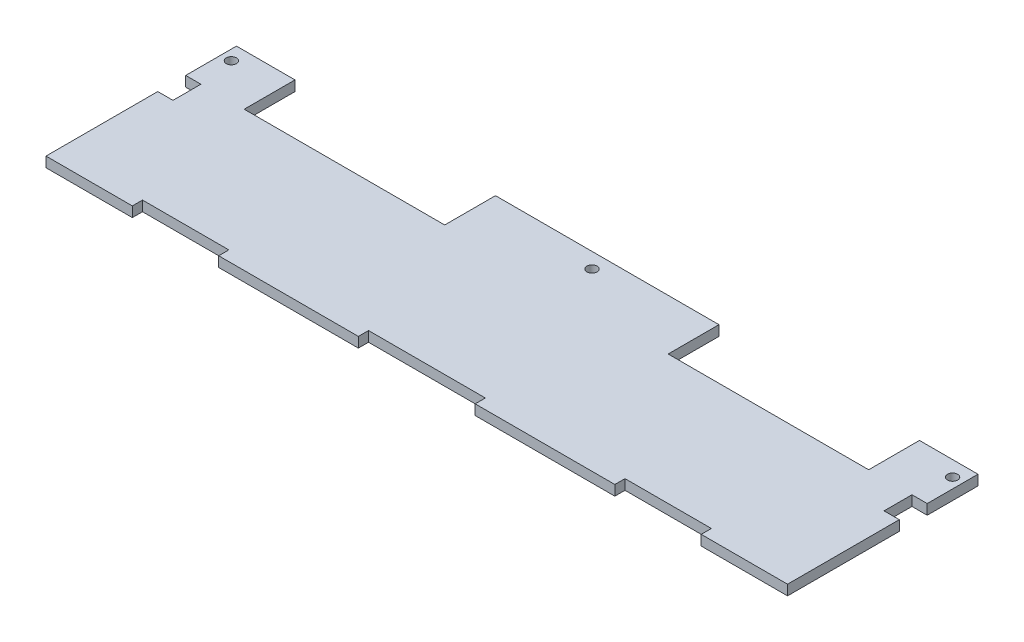
ISO-10303-21;
HEADER;
FILE_DESCRIPTION(('STEP AP214'),'2;1');
FILE_NAME('part.step','',(''),(''),'','','');
FILE_SCHEMA(('AUTOMOTIVE_DESIGN { 1 0 10303 214 1 1 1 1 }'));
ENDSEC;
DATA;
#1=APPLICATION_CONTEXT('core data for automotive mechanical design processes');
#2=APPLICATION_PROTOCOL_DEFINITION('international standard','automotive_design',2000,#1);
#3=PRODUCT_CONTEXT('',#1,'mechanical');
#4=PRODUCT('Part','Part','',(#3));
#5=PRODUCT_RELATED_PRODUCT_CATEGORY('part','',(#4));
#6=PRODUCT_DEFINITION_FORMATION('','',#4);
#7=PRODUCT_DEFINITION_CONTEXT('part definition',#1,'design');
#8=PRODUCT_DEFINITION('design','',#6,#7);
#9=PRODUCT_DEFINITION_SHAPE('','',#8);
#10=(LENGTH_UNIT() NAMED_UNIT(*) SI_UNIT(.MILLI.,.METRE.));
#11=(NAMED_UNIT(*) PLANE_ANGLE_UNIT() SI_UNIT($,.RADIAN.));
#12=(NAMED_UNIT(*) SI_UNIT($,.STERADIAN.) SOLID_ANGLE_UNIT());
#13=UNCERTAINTY_MEASURE_WITH_UNIT(LENGTH_MEASURE(1.E-05),#10,'distance_accuracy_value','');
#14=(GEOMETRIC_REPRESENTATION_CONTEXT(3) GLOBAL_UNCERTAINTY_ASSIGNED_CONTEXT((#13)) GLOBAL_UNIT_ASSIGNED_CONTEXT((#10,
#11,#12)) REPRESENTATION_CONTEXT('',''));
#15=CARTESIAN_POINT('',(0.,0.,0.));
#16=DIRECTION('',(0.,0.,1.));
#17=DIRECTION('',(1.,0.,0.));
#18=AXIS2_PLACEMENT_3D('',#15,#16,#17);
#19=CARTESIAN_POINT('',(146.,4.,37.5));
#20=DIRECTION('',(0.,0.,-1.));
#21=DIRECTION('',(-1.,0.,0.));
#22=AXIS2_PLACEMENT_3D('',#19,#20,#21);
#23=PLANE('',#22);
#24=DIRECTION('',(1.,0.,0.));
#25=VECTOR('',#24,1.);
#26=CARTESIAN_POINT('',(146.,4.,37.5));
#27=LINE('',#26,#25);
#28=CARTESIAN_POINT('',(-77.9999999999998,4.,37.5));
#29=VERTEX_POINT('',#28);
#30=CARTESIAN_POINT('',(-22.9999999999998,4.,37.5));
#31=VERTEX_POINT('',#30);
#32=EDGE_CURVE('E370',#29,#31,#27,.T.);
#33=ORIENTED_EDGE('',*,*,#32,.F.);
#34=DIRECTION('',(0.,1.,0.));
#35=VECTOR('',#34,1.);
#36=CARTESIAN_POINT('',(-77.9999999999998,0.,37.5));
#37=LINE('',#36,#35);
#38=CARTESIAN_POINT('',(-77.9999999999998,0.,37.5));
#39=VERTEX_POINT('',#38);
#40=EDGE_CURVE('E282',#39,#29,#37,.T.);
#41=ORIENTED_EDGE('',*,*,#40,.F.);
#42=DIRECTION('',(1.,0.,0.));
#43=VECTOR('',#42,1.);
#44=CARTESIAN_POINT('',(146.,0.,37.5));
#45=LINE('',#44,#43);
#46=CARTESIAN_POINT('',(-22.9999999999998,0.,37.5));
#47=VERTEX_POINT('',#46);
#48=EDGE_CURVE('E274',#39,#47,#45,.T.);
#49=ORIENTED_EDGE('',*,*,#48,.T.);
#50=DIRECTION('',(0.,1.,0.));
#51=VECTOR('',#50,1.);
#52=CARTESIAN_POINT('',(-22.9999999999998,0.,37.5));
#53=LINE('',#52,#51);
#54=EDGE_CURVE('E302',#47,#31,#53,.T.);
#55=ORIENTED_EDGE('',*,*,#54,.T.);
#56=EDGE_LOOP('',(#33,#41,#49,#55));
#57=FACE_BOUND('',#56,.T.);
#58=ADVANCED_FACE('F40',(#57),#23,.F.);
#59=CARTESIAN_POINT('',(0.,4.,0.));
#60=DIRECTION('',(0.,1.,0.));
#61=DIRECTION('',(0.,0.,1.));
#62=AXIS2_PLACEMENT_3D('',#59,#60,#61);
#63=PLANE('',#62);
#64=DIRECTION('',(0.,0.,-1.));
#65=VECTOR('',#64,1.);
#66=CARTESIAN_POINT('',(-77.9999999999998,4.,0.));
#67=LINE('',#66,#65);
#68=CARTESIAN_POINT('',(-77.9999999999998,4.,33.5));
#69=VERTEX_POINT('',#68);
#70=EDGE_CURVE('E256',#29,#69,#67,.T.);
#71=ORIENTED_EDGE('',*,*,#70,.F.);
#72=ORIENTED_EDGE('',*,*,#32,.T.);
#73=DIRECTION('',(0.,0.,-1.));
#74=VECTOR('',#73,1.);
#75=CARTESIAN_POINT('',(-22.9999999999998,4.,0.));
#76=LINE('',#75,#74);
#77=CARTESIAN_POINT('',(-22.9999999999998,4.,33.5));
#78=VERTEX_POINT('',#77);
#79=EDGE_CURVE('E290',#31,#78,#76,.T.);
#80=ORIENTED_EDGE('',*,*,#79,.T.);
#81=DIRECTION('',(1.,0.,0.));
#82=VECTOR('',#81,1.);
#83=CARTESIAN_POINT('',(0.,4.,33.5));
#84=LINE('',#83,#82);
#85=CARTESIAN_POINT('',(23.,4.,33.5));
#86=VERTEX_POINT('',#85);
#87=EDGE_CURVE('E297',#78,#86,#84,.T.);
#88=ORIENTED_EDGE('',*,*,#87,.T.);
#89=DIRECTION('',(0.,0.,-1.));
#90=VECTOR('',#89,1.);
#91=CARTESIAN_POINT('',(23.,4.,0.));
#92=LINE('',#91,#90);
#93=CARTESIAN_POINT('',(23.,4.,37.5));
#94=VERTEX_POINT('',#93);
#95=EDGE_CURVE('E284',#94,#86,#92,.T.);
#96=ORIENTED_EDGE('',*,*,#95,.F.);
#97=CARTESIAN_POINT('',(78.,4.,37.5));
#98=VERTEX_POINT('',#97);
#99=EDGE_CURVE('E615',#94,#98,#27,.T.);
#100=ORIENTED_EDGE('',*,*,#99,.T.);
#101=DIRECTION('',(0.,0.,-1.));
#102=VECTOR('',#101,1.);
#103=CARTESIAN_POINT('',(78.,4.,0.));
#104=LINE('',#103,#102);
#105=CARTESIAN_POINT('',(78.,4.,33.5));
#106=VERTEX_POINT('',#105);
#107=EDGE_CURVE('E314',#98,#106,#104,.T.);
#108=ORIENTED_EDGE('',*,*,#107,.T.);
#109=DIRECTION('',(1.,0.,0.));
#110=VECTOR('',#109,1.);
#111=CARTESIAN_POINT('',(0.,4.,33.5));
#112=LINE('',#111,#110);
#113=CARTESIAN_POINT('',(112.,4.,33.5));
#114=VERTEX_POINT('',#113);
#115=EDGE_CURVE('E321',#106,#114,#112,.T.);
#116=ORIENTED_EDGE('',*,*,#115,.T.);
#117=DIRECTION('',(0.,0.,1.));
#118=VECTOR('',#117,1.);
#119=CARTESIAN_POINT('',(112.,4.,0.));
#120=LINE('',#119,#118);
#121=CARTESIAN_POINT('',(112.,4.,37.5));
#122=VERTEX_POINT('',#121);
#123=EDGE_CURVE('E305',#114,#122,#120,.T.);
#124=ORIENTED_EDGE('',*,*,#123,.T.);
#125=CARTESIAN_POINT('',(146.,4.,37.5));
#126=VERTEX_POINT('',#125);
#127=EDGE_CURVE('E365',#122,#126,#27,.T.);
#128=ORIENTED_EDGE('',*,*,#127,.T.);
#129=DIRECTION('',(0.,0.,-1.));
#130=VECTOR('',#129,1.);
#131=CARTESIAN_POINT('',(146.,4.,37.5));
#132=LINE('',#131,#130);
#133=CARTESIAN_POINT('',(146.,4.,-6.49999999999996));
#134=VERTEX_POINT('',#133);
#135=EDGE_CURVE('E369',#126,#134,#132,.T.);
#136=ORIENTED_EDGE('',*,*,#135,.T.);
#137=DIRECTION('',(-1.,0.,0.));
#138=VECTOR('',#137,1.);
#139=CARTESIAN_POINT('',(146.,4.,-6.49999999999996));
#140=LINE('',#139,#138);
#141=CARTESIAN_POINT('',(140.,4.,-6.49999999999996));
#142=VERTEX_POINT('',#141);
#143=EDGE_CURVE('E372',#134,#142,#140,.T.);
#144=ORIENTED_EDGE('',*,*,#143,.T.);
#145=DIRECTION('',(0.,0.,-1.));
#146=VECTOR('',#145,1.);
#147=CARTESIAN_POINT('',(140.,4.,-17.5));
#148=LINE('',#147,#146);
#149=CARTESIAN_POINT('',(140.,4.,-17.5));
#150=VERTEX_POINT('',#149);
#151=EDGE_CURVE('E374',#142,#150,#148,.T.);
#152=ORIENTED_EDGE('',*,*,#151,.T.);
#153=DIRECTION('',(1.,0.,0.));
#154=VECTOR('',#153,1.);
#155=CARTESIAN_POINT('',(146.,4.,-17.5));
#156=LINE('',#155,#154);
#157=CARTESIAN_POINT('',(146.,4.,-17.5));
#158=VERTEX_POINT('',#157);
#159=EDGE_CURVE('E376',#150,#158,#156,.T.);
#160=ORIENTED_EDGE('',*,*,#159,.T.);
#161=DIRECTION('',(0.,0.,-1.));
#162=VECTOR('',#161,1.);
#163=CARTESIAN_POINT('',(146.,4.,-17.5));
#164=LINE('',#163,#162);
#165=CARTESIAN_POINT('',(146.,4.,-37.5));
#166=VERTEX_POINT('',#165);
#167=EDGE_CURVE('E378',#158,#166,#164,.T.);
#168=ORIENTED_EDGE('',*,*,#167,.T.);
#169=DIRECTION('',(-1.,0.,0.));
#170=VECTOR('',#169,1.);
#171=CARTESIAN_POINT('',(146.,4.,-37.5));
#172=LINE('',#171,#170);
#173=CARTESIAN_POINT('',(122.95,4.,-37.5));
#174=VERTEX_POINT('',#173);
#175=EDGE_CURVE('E380',#166,#174,#172,.T.);
#176=ORIENTED_EDGE('',*,*,#175,.T.);
#177=DIRECTION('',(0.,0.,1.));
#178=VECTOR('',#177,1.);
#179=CARTESIAN_POINT('',(122.95,4.,-37.5));
#180=LINE('',#179,#178);
#181=CARTESIAN_POINT('',(122.95,4.,-17.5));
#182=VERTEX_POINT('',#181);
#183=EDGE_CURVE('E382',#174,#182,#180,.T.);
#184=ORIENTED_EDGE('',*,*,#183,.T.);
#185=DIRECTION('',(-1.,0.,0.));
#186=VECTOR('',#185,1.);
#187=CARTESIAN_POINT('',(44.,4.,-17.5));
#188=LINE('',#187,#186);
#189=CARTESIAN_POINT('',(44.,4.,-17.5));
#190=VERTEX_POINT('',#189);
#191=EDGE_CURVE('E384',#182,#190,#188,.T.);
#192=ORIENTED_EDGE('',*,*,#191,.T.);
#193=DIRECTION('',(0.,0.,-1.));
#194=VECTOR('',#193,1.);
#195=CARTESIAN_POINT('',(44.,4.,-37.5));
#196=LINE('',#195,#194);
#197=CARTESIAN_POINT('',(44.,4.,-37.5));
#198=VERTEX_POINT('',#197);
#199=EDGE_CURVE('E386',#190,#198,#196,.T.);
#200=ORIENTED_EDGE('',*,*,#199,.T.);
#201=DIRECTION('',(-1.,0.,0.));
#202=VECTOR('',#201,1.);
#203=CARTESIAN_POINT('',(44.,4.,-37.5));
#204=LINE('',#203,#202);
#205=CARTESIAN_POINT('',(-44.,4.,-37.5));
#206=VERTEX_POINT('',#205);
#207=EDGE_CURVE('E388',#198,#206,#204,.T.);
#208=ORIENTED_EDGE('',*,*,#207,.T.);
#209=DIRECTION('',(0.,0.,1.));
#210=VECTOR('',#209,1.);
#211=CARTESIAN_POINT('',(-44.,4.,-17.5));
#212=LINE('',#211,#210);
#213=CARTESIAN_POINT('',(-44.,4.,-17.5));
#214=VERTEX_POINT('',#213);
#215=EDGE_CURVE('E390',#206,#214,#212,.T.);
#216=ORIENTED_EDGE('',*,*,#215,.T.);
#217=DIRECTION('',(-1.,0.,0.));
#218=VECTOR('',#217,1.);
#219=CARTESIAN_POINT('',(-122.95,4.,-17.5));
#220=LINE('',#219,#218);
#221=CARTESIAN_POINT('',(-122.95,4.,-17.5));
#222=VERTEX_POINT('',#221);
#223=EDGE_CURVE('E392',#214,#222,#220,.T.);
#224=ORIENTED_EDGE('',*,*,#223,.T.);
#225=DIRECTION('',(0.,0.,-1.));
#226=VECTOR('',#225,1.);
#227=CARTESIAN_POINT('',(-122.95,4.,-37.5));
#228=LINE('',#227,#226);
#229=CARTESIAN_POINT('',(-122.95,4.,-37.5));
#230=VERTEX_POINT('',#229);
#231=EDGE_CURVE('E394',#222,#230,#228,.T.);
#232=ORIENTED_EDGE('',*,*,#231,.T.);
#233=DIRECTION('',(-1.,0.,0.));
#234=VECTOR('',#233,1.);
#235=CARTESIAN_POINT('',(-122.95,4.,-37.5));
#236=LINE('',#235,#234);
#237=CARTESIAN_POINT('',(-146.,4.,-37.5));
#238=VERTEX_POINT('',#237);
#239=EDGE_CURVE('E396',#230,#238,#236,.T.);
#240=ORIENTED_EDGE('',*,*,#239,.T.);
#241=DIRECTION('',(0.,0.,1.));
#242=VECTOR('',#241,1.);
#243=CARTESIAN_POINT('',(-146.,4.,-17.4999999999997));
#244=LINE('',#243,#242);
#245=CARTESIAN_POINT('',(-146.,4.,-17.4999999999997));
#246=VERTEX_POINT('',#245);
#247=EDGE_CURVE('E353',#238,#246,#244,.T.);
#248=ORIENTED_EDGE('',*,*,#247,.T.);
#249=DIRECTION('',(1.,0.,0.));
#250=VECTOR('',#249,1.);
#251=CARTESIAN_POINT('',(-146.,4.,-17.4999999999997));
#252=LINE('',#251,#250);
#253=CARTESIAN_POINT('',(-140.,4.,-17.4999999999997));
#254=VERTEX_POINT('',#253);
#255=EDGE_CURVE('E356',#246,#254,#252,.T.);
#256=ORIENTED_EDGE('',*,*,#255,.T.);
#257=DIRECTION('',(0.,0.,1.));
#258=VECTOR('',#257,1.);
#259=CARTESIAN_POINT('',(-140.,4.,-17.4999999999997));
#260=LINE('',#259,#258);
#261=CARTESIAN_POINT('',(-140.,4.,-6.49999999999975));
#262=VERTEX_POINT('',#261);
#263=EDGE_CURVE('E359',#254,#262,#260,.T.);
#264=ORIENTED_EDGE('',*,*,#263,.T.);
#265=DIRECTION('',(-1.,0.,0.));
#266=VECTOR('',#265,1.);
#267=CARTESIAN_POINT('',(-146.,4.,-6.49999999999974));
#268=LINE('',#267,#266);
#269=CARTESIAN_POINT('',(-146.,4.,-6.49999999999974));
#270=VERTEX_POINT('',#269);
#271=EDGE_CURVE('E361',#262,#270,#268,.T.);
#272=ORIENTED_EDGE('',*,*,#271,.T.);
#273=DIRECTION('',(0.,0.,1.));
#274=VECTOR('',#273,1.);
#275=CARTESIAN_POINT('',(-146.,4.,37.5));
#276=LINE('',#275,#274);
#277=CARTESIAN_POINT('',(-146.,4.,37.5));
#278=VERTEX_POINT('',#277);
#279=EDGE_CURVE('E363',#270,#278,#276,.T.);
#280=ORIENTED_EDGE('',*,*,#279,.T.);
#281=CARTESIAN_POINT('',(-112.,4.,37.5));
#282=VERTEX_POINT('',#281);
#283=EDGE_CURVE('E366',#278,#282,#27,.T.);
#284=ORIENTED_EDGE('',*,*,#283,.T.);
#285=DIRECTION('',(0.,0.,1.));
#286=VECTOR('',#285,1.);
#287=CARTESIAN_POINT('',(-112.,4.,0.));
#288=LINE('',#287,#286);
#289=CARTESIAN_POINT('',(-112.,4.,33.5));
#290=VERTEX_POINT('',#289);
#291=EDGE_CURVE('E55',#290,#282,#288,.T.);
#292=ORIENTED_EDGE('',*,*,#291,.F.);
#293=DIRECTION('',(-1.,0.,0.));
#294=VECTOR('',#293,1.);
#295=CARTESIAN_POINT('',(0.,4.,33.5));
#296=LINE('',#295,#294);
#297=EDGE_CURVE('E276',#69,#290,#296,.T.);
#298=ORIENTED_EDGE('',*,*,#297,.F.);
#299=EDGE_LOOP('',(#71,#72,#80,#88,#96,#100,#108,#116,#124,#128,#136,#144,#152,#160,#168,#176,
#184,#192,#200,#208,#216,#224,#232,#240,#248,#256,#264,#272,#280,#284,#292,#298));
#300=FACE_BOUND('',#299,.T.);
#301=CARTESIAN_POINT('',(142.,4.,-31.5));
#302=DIRECTION('',(0.,1.,0.));
#303=DIRECTION('',(0.,0.,1.));
#304=AXIS2_PLACEMENT_3D('',#301,#302,#303);
#305=CIRCLE('',#304,2.);
#306=CARTESIAN_POINT('',(142.,4.,-29.5));
#307=VERTEX_POINT('',#306);
#308=EDGE_CURVE('E341',#307,#307,#305,.T.);
#309=ORIENTED_EDGE('',*,*,#308,.F.);
#310=EDGE_LOOP('',(#309));
#311=FACE_BOUND('',#310,.T.);
#312=CARTESIAN_POINT('',(-142.,4.,-31.5));
#313=DIRECTION('',(0.,1.,0.));
#314=DIRECTION('',(0.,0.,1.));
#315=AXIS2_PLACEMENT_3D('',#312,#313,#314);
#316=CIRCLE('',#315,2.);
#317=CARTESIAN_POINT('',(-142.,4.,-29.5));
#318=VERTEX_POINT('',#317);
#319=EDGE_CURVE('E347',#318,#318,#316,.T.);
#320=ORIENTED_EDGE('',*,*,#319,.F.);
#321=EDGE_LOOP('',(#320));
#322=FACE_BOUND('',#321,.T.);
#323=CARTESIAN_POINT('',(0.,4.,-31.5));
#324=DIRECTION('',(0.,1.,0.));
#325=DIRECTION('',(0.,0.,1.));
#326=AXIS2_PLACEMENT_3D('',#323,#324,#325);
#327=CIRCLE('',#326,2.);
#328=CARTESIAN_POINT('',(0.,4.,-29.5));
#329=VERTEX_POINT('',#328);
#330=EDGE_CURVE('E335',#329,#329,#327,.T.);
#331=ORIENTED_EDGE('',*,*,#330,.F.);
#332=EDGE_LOOP('',(#331));
#333=FACE_BOUND('',#332,.T.);
#334=ADVANCED_FACE('F514',(#300,#311,#322,#333),#63,.T.);
#335=CARTESIAN_POINT('',(0.,0.,0.));
#336=DIRECTION('',(0.,1.,0.));
#337=DIRECTION('',(0.,0.,1.));
#338=AXIS2_PLACEMENT_3D('',#335,#336,#337);
#339=PLANE('',#338);
#340=ORIENTED_EDGE('',*,*,#48,.F.);
#341=DIRECTION('',(0.,0.,-1.));
#342=VECTOR('',#341,1.);
#343=CARTESIAN_POINT('',(-77.9999999999998,0.,0.));
#344=LINE('',#343,#342);
#345=CARTESIAN_POINT('',(-77.9999999999998,0.,33.5));
#346=VERTEX_POINT('',#345);
#347=EDGE_CURVE('E253',#39,#346,#344,.T.);
#348=ORIENTED_EDGE('',*,*,#347,.T.);
#349=DIRECTION('',(-1.,0.,0.));
#350=VECTOR('',#349,1.);
#351=CARTESIAN_POINT('',(0.,0.,33.5));
#352=LINE('',#351,#350);
#353=CARTESIAN_POINT('',(-112.,0.,33.5));
#354=VERTEX_POINT('',#353);
#355=EDGE_CURVE('E264',#346,#354,#352,.T.);
#356=ORIENTED_EDGE('',*,*,#355,.T.);
#357=DIRECTION('',(0.,0.,1.));
#358=VECTOR('',#357,1.);
#359=CARTESIAN_POINT('',(-112.,0.,0.));
#360=LINE('',#359,#358);
#361=CARTESIAN_POINT('',(-112.,0.,37.5));
#362=VERTEX_POINT('',#361);
#363=EDGE_CURVE('E261',#354,#362,#360,.T.);
#364=ORIENTED_EDGE('',*,*,#363,.T.);
#365=CARTESIAN_POINT('',(-146.,0.,37.5));
#366=VERTEX_POINT('',#365);
#367=EDGE_CURVE('E410',#366,#362,#45,.T.);
#368=ORIENTED_EDGE('',*,*,#367,.F.);
#369=DIRECTION('',(0.,0.,1.));
#370=VECTOR('',#369,1.);
#371=CARTESIAN_POINT('',(-146.,0.,37.5));
#372=LINE('',#371,#370);
#373=CARTESIAN_POINT('',(-146.,0.,-6.49999999999974));
#374=VERTEX_POINT('',#373);
#375=EDGE_CURVE('E407',#374,#366,#372,.T.);
#376=ORIENTED_EDGE('',*,*,#375,.F.);
#377=DIRECTION('',(-1.,0.,0.));
#378=VECTOR('',#377,1.);
#379=CARTESIAN_POINT('',(-146.,0.,-6.49999999999974));
#380=LINE('',#379,#378);
#381=CARTESIAN_POINT('',(-140.,0.,-6.49999999999975));
#382=VERTEX_POINT('',#381);
#383=EDGE_CURVE('E405',#382,#374,#380,.T.);
#384=ORIENTED_EDGE('',*,*,#383,.F.);
#385=DIRECTION('',(0.,0.,1.));
#386=VECTOR('',#385,1.);
#387=CARTESIAN_POINT('',(-140.,0.,-17.4999999999997));
#388=LINE('',#387,#386);
#389=CARTESIAN_POINT('',(-140.,0.,-17.4999999999997));
#390=VERTEX_POINT('',#389);
#391=EDGE_CURVE('E403',#390,#382,#388,.T.);
#392=ORIENTED_EDGE('',*,*,#391,.F.);
#393=DIRECTION('',(1.,0.,0.));
#394=VECTOR('',#393,1.);
#395=CARTESIAN_POINT('',(-146.,0.,-17.4999999999997));
#396=LINE('',#395,#394);
#397=CARTESIAN_POINT('',(-146.,0.,-17.4999999999997));
#398=VERTEX_POINT('',#397);
#399=EDGE_CURVE('E401',#398,#390,#396,.T.);
#400=ORIENTED_EDGE('',*,*,#399,.F.);
#401=DIRECTION('',(0.,0.,1.));
#402=VECTOR('',#401,1.);
#403=CARTESIAN_POINT('',(-146.,0.,-17.4999999999997));
#404=LINE('',#403,#402);
#405=CARTESIAN_POINT('',(-146.,0.,-37.5));
#406=VERTEX_POINT('',#405);
#407=EDGE_CURVE('E350',#406,#398,#404,.T.);
#408=ORIENTED_EDGE('',*,*,#407,.F.);
#409=DIRECTION('',(-1.,0.,0.));
#410=VECTOR('',#409,1.);
#411=CARTESIAN_POINT('',(-122.95,0.,-37.5));
#412=LINE('',#411,#410);
#413=CARTESIAN_POINT('',(-122.95,0.,-37.5));
#414=VERTEX_POINT('',#413);
#415=EDGE_CURVE('E357',#414,#406,#412,.T.);
#416=ORIENTED_EDGE('',*,*,#415,.F.);
#417=DIRECTION('',(0.,0.,-1.));
#418=VECTOR('',#417,1.);
#419=CARTESIAN_POINT('',(-122.95,0.,-37.5));
#420=LINE('',#419,#418);
#421=CARTESIAN_POINT('',(-122.95,0.,-17.5));
#422=VERTEX_POINT('',#421);
#423=EDGE_CURVE('E437',#422,#414,#420,.T.);
#424=ORIENTED_EDGE('',*,*,#423,.F.);
#425=DIRECTION('',(-1.,0.,0.));
#426=VECTOR('',#425,1.);
#427=CARTESIAN_POINT('',(-122.95,0.,-17.5));
#428=LINE('',#427,#426);
#429=CARTESIAN_POINT('',(-44.,0.,-17.5));
#430=VERTEX_POINT('',#429);
#431=EDGE_CURVE('E435',#430,#422,#428,.T.);
#432=ORIENTED_EDGE('',*,*,#431,.F.);
#433=DIRECTION('',(0.,0.,1.));
#434=VECTOR('',#433,1.);
#435=CARTESIAN_POINT('',(-44.,0.,-17.5));
#436=LINE('',#435,#434);
#437=CARTESIAN_POINT('',(-44.,0.,-37.5));
#438=VERTEX_POINT('',#437);
#439=EDGE_CURVE('E433',#438,#430,#436,.T.);
#440=ORIENTED_EDGE('',*,*,#439,.F.);
#441=DIRECTION('',(-1.,0.,0.));
#442=VECTOR('',#441,1.);
#443=CARTESIAN_POINT('',(44.,0.,-37.5));
#444=LINE('',#443,#442);
#445=CARTESIAN_POINT('',(44.,0.,-37.5));
#446=VERTEX_POINT('',#445);
#447=EDGE_CURVE('E431',#446,#438,#444,.T.);
#448=ORIENTED_EDGE('',*,*,#447,.F.);
#449=DIRECTION('',(0.,0.,-1.));
#450=VECTOR('',#449,1.);
#451=CARTESIAN_POINT('',(44.,0.,-37.5));
#452=LINE('',#451,#450);
#453=CARTESIAN_POINT('',(44.,0.,-17.5));
#454=VERTEX_POINT('',#453);
#455=EDGE_CURVE('E429',#454,#446,#452,.T.);
#456=ORIENTED_EDGE('',*,*,#455,.F.);
#457=DIRECTION('',(-1.,0.,0.));
#458=VECTOR('',#457,1.);
#459=CARTESIAN_POINT('',(44.,0.,-17.5));
#460=LINE('',#459,#458);
#461=CARTESIAN_POINT('',(122.95,0.,-17.5));
#462=VERTEX_POINT('',#461);
#463=EDGE_CURVE('E427',#462,#454,#460,.T.);
#464=ORIENTED_EDGE('',*,*,#463,.F.);
#465=DIRECTION('',(0.,0.,1.));
#466=VECTOR('',#465,1.);
#467=CARTESIAN_POINT('',(122.95,0.,-37.5));
#468=LINE('',#467,#466);
#469=CARTESIAN_POINT('',(122.95,0.,-37.5));
#470=VERTEX_POINT('',#469);
#471=EDGE_CURVE('E425',#470,#462,#468,.T.);
#472=ORIENTED_EDGE('',*,*,#471,.F.);
#473=DIRECTION('',(-1.,0.,0.));
#474=VECTOR('',#473,1.);
#475=CARTESIAN_POINT('',(146.,0.,-37.5));
#476=LINE('',#475,#474);
#477=CARTESIAN_POINT('',(146.,0.,-37.5));
#478=VERTEX_POINT('',#477);
#479=EDGE_CURVE('E423',#478,#470,#476,.T.);
#480=ORIENTED_EDGE('',*,*,#479,.F.);
#481=DIRECTION('',(0.,0.,-1.));
#482=VECTOR('',#481,1.);
#483=CARTESIAN_POINT('',(146.,0.,-17.5));
#484=LINE('',#483,#482);
#485=CARTESIAN_POINT('',(146.,0.,-17.5));
#486=VERTEX_POINT('',#485);
#487=EDGE_CURVE('E421',#486,#478,#484,.T.);
#488=ORIENTED_EDGE('',*,*,#487,.F.);
#489=DIRECTION('',(1.,0.,0.));
#490=VECTOR('',#489,1.);
#491=CARTESIAN_POINT('',(146.,0.,-17.5));
#492=LINE('',#491,#490);
#493=CARTESIAN_POINT('',(140.,0.,-17.5));
#494=VERTEX_POINT('',#493);
#495=EDGE_CURVE('E419',#494,#486,#492,.T.);
#496=ORIENTED_EDGE('',*,*,#495,.F.);
#497=DIRECTION('',(0.,0.,-1.));
#498=VECTOR('',#497,1.);
#499=CARTESIAN_POINT('',(140.,0.,-17.5));
#500=LINE('',#499,#498);
#501=CARTESIAN_POINT('',(140.,0.,-6.49999999999996));
#502=VERTEX_POINT('',#501);
#503=EDGE_CURVE('E417',#502,#494,#500,.T.);
#504=ORIENTED_EDGE('',*,*,#503,.F.);
#505=DIRECTION('',(-1.,0.,0.));
#506=VECTOR('',#505,1.);
#507=CARTESIAN_POINT('',(146.,0.,-6.49999999999996));
#508=LINE('',#507,#506);
#509=CARTESIAN_POINT('',(146.,0.,-6.49999999999996));
#510=VERTEX_POINT('',#509);
#511=EDGE_CURVE('E415',#510,#502,#508,.T.);
#512=ORIENTED_EDGE('',*,*,#511,.F.);
#513=DIRECTION('',(0.,0.,-1.));
#514=VECTOR('',#513,1.);
#515=CARTESIAN_POINT('',(146.,0.,37.5));
#516=LINE('',#515,#514);
#517=CARTESIAN_POINT('',(146.,0.,37.5));
#518=VERTEX_POINT('',#517);
#519=EDGE_CURVE('E413',#518,#510,#516,.T.);
#520=ORIENTED_EDGE('',*,*,#519,.F.);
#521=CARTESIAN_POINT('',(112.,0.,37.5));
#522=VERTEX_POINT('',#521);
#523=EDGE_CURVE('E409',#522,#518,#45,.T.);
#524=ORIENTED_EDGE('',*,*,#523,.F.);
#525=DIRECTION('',(0.,0.,1.));
#526=VECTOR('',#525,1.);
#527=CARTESIAN_POINT('',(112.,0.,0.));
#528=LINE('',#527,#526);
#529=CARTESIAN_POINT('',(112.,0.,33.5));
#530=VERTEX_POINT('',#529);
#531=EDGE_CURVE('E311',#530,#522,#528,.T.);
#532=ORIENTED_EDGE('',*,*,#531,.F.);
#533=DIRECTION('',(1.,0.,0.));
#534=VECTOR('',#533,1.);
#535=CARTESIAN_POINT('',(0.,0.,33.5));
#536=LINE('',#535,#534);
#537=CARTESIAN_POINT('',(78.,0.,33.5));
#538=VERTEX_POINT('',#537);
#539=EDGE_CURVE('E313',#538,#530,#536,.T.);
#540=ORIENTED_EDGE('',*,*,#539,.F.);
#541=DIRECTION('',(0.,0.,-1.));
#542=VECTOR('',#541,1.);
#543=CARTESIAN_POINT('',(78.,0.,0.));
#544=LINE('',#543,#542);
#545=CARTESIAN_POINT('',(78.,0.,37.5));
#546=VERTEX_POINT('',#545);
#547=EDGE_CURVE('E316',#546,#538,#544,.T.);
#548=ORIENTED_EDGE('',*,*,#547,.F.);
#549=CARTESIAN_POINT('',(23.,0.,37.5));
#550=VERTEX_POINT('',#549);
#551=EDGE_CURVE('E597',#550,#546,#45,.T.);
#552=ORIENTED_EDGE('',*,*,#551,.F.);
#553=DIRECTION('',(0.,0.,-1.));
#554=VECTOR('',#553,1.);
#555=CARTESIAN_POINT('',(23.,0.,0.));
#556=LINE('',#555,#554);
#557=CARTESIAN_POINT('',(23.,0.,33.5));
#558=VERTEX_POINT('',#557);
#559=EDGE_CURVE('E63',#550,#558,#556,.T.);
#560=ORIENTED_EDGE('',*,*,#559,.T.);
#561=DIRECTION('',(1.,0.,0.));
#562=VECTOR('',#561,1.);
#563=CARTESIAN_POINT('',(0.,0.,33.5));
#564=LINE('',#563,#562);
#565=CARTESIAN_POINT('',(-22.9999999999998,0.,33.5));
#566=VERTEX_POINT('',#565);
#567=EDGE_CURVE('E289',#566,#558,#564,.T.);
#568=ORIENTED_EDGE('',*,*,#567,.F.);
#569=DIRECTION('',(0.,0.,-1.));
#570=VECTOR('',#569,1.);
#571=CARTESIAN_POINT('',(-22.9999999999998,0.,0.));
#572=LINE('',#571,#570);
#573=EDGE_CURVE('E292',#47,#566,#572,.T.);
#574=ORIENTED_EDGE('',*,*,#573,.F.);
#575=EDGE_LOOP('',(#340,#348,#356,#364,#368,#376,#384,#392,#400,#408,#416,#424,#432,#440,#448,
#456,#464,#472,#480,#488,#496,#504,#512,#520,#524,#532,#540,#548,#552,#560,#568,#574));
#576=FACE_BOUND('',#575,.T.);
#577=CARTESIAN_POINT('',(-142.,0.,-31.5));
#578=DIRECTION('',(0.,1.,0.));
#579=DIRECTION('',(0.,0.,1.));
#580=AXIS2_PLACEMENT_3D('',#577,#578,#579);
#581=CIRCLE('',#580,2.);
#582=CARTESIAN_POINT('',(-142.,0.,-29.5));
#583=VERTEX_POINT('',#582);
#584=EDGE_CURVE('E344',#583,#583,#581,.T.);
#585=ORIENTED_EDGE('',*,*,#584,.T.);
#586=EDGE_LOOP('',(#585));
#587=FACE_BOUND('',#586,.T.);
#588=CARTESIAN_POINT('',(142.,0.,-31.5));
#589=DIRECTION('',(0.,1.,0.));
#590=DIRECTION('',(0.,0.,1.));
#591=AXIS2_PLACEMENT_3D('',#588,#589,#590);
#592=CIRCLE('',#591,2.);
#593=CARTESIAN_POINT('',(142.,0.,-29.5));
#594=VERTEX_POINT('',#593);
#595=EDGE_CURVE('E338',#594,#594,#592,.T.);
#596=ORIENTED_EDGE('',*,*,#595,.T.);
#597=EDGE_LOOP('',(#596));
#598=FACE_BOUND('',#597,.T.);
#599=CARTESIAN_POINT('',(0.,0.,-31.5));
#600=DIRECTION('',(0.,1.,0.));
#601=DIRECTION('',(0.,0.,1.));
#602=AXIS2_PLACEMENT_3D('',#599,#600,#601);
#603=CIRCLE('',#602,2.);
#604=CARTESIAN_POINT('',(0.,0.,-29.5));
#605=VERTEX_POINT('',#604);
#606=EDGE_CURVE('E328',#605,#605,#603,.T.);
#607=ORIENTED_EDGE('',*,*,#606,.T.);
#608=EDGE_LOOP('',(#607));
#609=FACE_BOUND('',#608,.T.);
#610=ADVANCED_FACE('F271',(#576,#587,#598,#609),#339,.F.);
#611=ORIENTED_EDGE('',*,*,#367,.T.);
#612=DIRECTION('',(0.,1.,0.));
#613=VECTOR('',#612,1.);
#614=CARTESIAN_POINT('',(-112.,0.,37.5));
#615=LINE('',#614,#613);
#616=EDGE_CURVE('E285',#362,#282,#615,.T.);
#617=ORIENTED_EDGE('',*,*,#616,.T.);
#618=ORIENTED_EDGE('',*,*,#283,.F.);
#619=DIRECTION('',(0.,-1.,0.));
#620=VECTOR('',#619,1.);
#621=CARTESIAN_POINT('',(-146.,4.,37.5));
#622=LINE('',#621,#620);
#623=EDGE_CURVE('E484',#278,#366,#622,.T.);
#624=ORIENTED_EDGE('',*,*,#623,.T.);
#625=EDGE_LOOP('',(#611,#617,#618,#624));
#626=FACE_BOUND('',#625,.T.);
#627=ADVANCED_FACE('F632',(#626),#23,.F.);
#628=DIRECTION('',(0.,1.,0.));
#629=VECTOR('',#628,1.);
#630=CARTESIAN_POINT('',(112.,0.,37.5));
#631=LINE('',#630,#629);
#632=EDGE_CURVE('E326',#522,#122,#631,.T.);
#633=ORIENTED_EDGE('',*,*,#632,.F.);
#634=ORIENTED_EDGE('',*,*,#523,.T.);
#635=DIRECTION('',(0.,-1.,0.));
#636=VECTOR('',#635,1.);
#637=CARTESIAN_POINT('',(146.,4.,37.5));
#638=LINE('',#637,#636);
#639=EDGE_CURVE('E481',#126,#518,#638,.T.);
#640=ORIENTED_EDGE('',*,*,#639,.F.);
#641=ORIENTED_EDGE('',*,*,#127,.F.);
#642=EDGE_LOOP('',(#633,#634,#640,#641));
#643=FACE_BOUND('',#642,.T.);
#644=ADVANCED_FACE('F595',(#643),#23,.F.);
#645=ORIENTED_EDGE('',*,*,#99,.F.);
#646=DIRECTION('',(0.,1.,0.));
#647=VECTOR('',#646,1.);
#648=CARTESIAN_POINT('',(23.,0.,37.5));
#649=LINE('',#648,#647);
#650=EDGE_CURVE('E294',#550,#94,#649,.T.);
#651=ORIENTED_EDGE('',*,*,#650,.F.);
#652=ORIENTED_EDGE('',*,*,#551,.T.);
#653=DIRECTION('',(0.,1.,0.));
#654=VECTOR('',#653,1.);
#655=CARTESIAN_POINT('',(78.,0.,37.5));
#656=LINE('',#655,#654);
#657=EDGE_CURVE('E329',#546,#98,#656,.T.);
#658=ORIENTED_EDGE('',*,*,#657,.T.);
#659=EDGE_LOOP('',(#645,#651,#652,#658));
#660=FACE_BOUND('',#659,.T.);
#661=ADVANCED_FACE('F629',(#660),#23,.F.);
#662=CARTESIAN_POINT('',(-146.,4.,-17.4999999999997));
#663=DIRECTION('',(1.,0.,0.));
#664=DIRECTION('',(0.,0.,-1.));
#665=AXIS2_PLACEMENT_3D('',#662,#663,#664);
#666=PLANE('',#665);
#667=ORIENTED_EDGE('',*,*,#407,.T.);
#668=DIRECTION('',(0.,-1.,0.));
#669=VECTOR('',#668,1.);
#670=CARTESIAN_POINT('',(-146.,4.,-17.4999999999997));
#671=LINE('',#670,#669);
#672=EDGE_CURVE('E11',#246,#398,#671,.T.);
#673=ORIENTED_EDGE('',*,*,#672,.F.);
#674=ORIENTED_EDGE('',*,*,#247,.F.);
#675=DIRECTION('',(0.,-1.,0.));
#676=VECTOR('',#675,1.);
#677=CARTESIAN_POINT('',(-146.,4.,-37.5));
#678=LINE('',#677,#676);
#679=EDGE_CURVE('E398',#238,#406,#678,.T.);
#680=ORIENTED_EDGE('',*,*,#679,.T.);
#681=EDGE_LOOP('',(#667,#673,#674,#680));
#682=FACE_BOUND('',#681,.T.);
#683=ADVANCED_FACE('F42',(#682),#666,.F.);
#684=CARTESIAN_POINT('',(-146.,4.,-17.4999999999997));
#685=DIRECTION('',(0.,0.,-1.));
#686=DIRECTION('',(-1.,0.,0.));
#687=AXIS2_PLACEMENT_3D('',#684,#685,#686);
#688=PLANE('',#687);
#689=ORIENTED_EDGE('',*,*,#399,.T.);
#690=DIRECTION('',(0.,-1.,0.));
#691=VECTOR('',#690,1.);
#692=CARTESIAN_POINT('',(-140.,4.,-17.4999999999997));
#693=LINE('',#692,#691);
#694=EDGE_CURVE('E48',#254,#390,#693,.T.);
#695=ORIENTED_EDGE('',*,*,#694,.F.);
#696=ORIENTED_EDGE('',*,*,#255,.F.);
#697=ORIENTED_EDGE('',*,*,#672,.T.);
#698=EDGE_LOOP('',(#689,#695,#696,#697));
#699=FACE_BOUND('',#698,.T.);
#700=ADVANCED_FACE('F518',(#699),#688,.F.);
#701=CARTESIAN_POINT('',(-140.,4.,-17.4999999999997));
#702=DIRECTION('',(1.,0.,0.));
#703=DIRECTION('',(0.,0.,-1.));
#704=AXIS2_PLACEMENT_3D('',#701,#702,#703);
#705=PLANE('',#704);
#706=ORIENTED_EDGE('',*,*,#391,.T.);
#707=DIRECTION('',(0.,-1.,0.));
#708=VECTOR('',#707,1.);
#709=CARTESIAN_POINT('',(-140.,4.,-6.49999999999975));
#710=LINE('',#709,#708);
#711=EDGE_CURVE('E490',#262,#382,#710,.T.);
#712=ORIENTED_EDGE('',*,*,#711,.F.);
#713=ORIENTED_EDGE('',*,*,#263,.F.);
#714=ORIENTED_EDGE('',*,*,#694,.T.);
#715=EDGE_LOOP('',(#706,#712,#713,#714));
#716=FACE_BOUND('',#715,.T.);
#717=ADVANCED_FACE('F497',(#716),#705,.F.);
#718=CARTESIAN_POINT('',(-146.,4.,-6.49999999999974));
#719=DIRECTION('',(0.,0.,1.));
#720=DIRECTION('',(1.,0.,0.));
#721=AXIS2_PLACEMENT_3D('',#718,#719,#720);
#722=PLANE('',#721);
#723=ORIENTED_EDGE('',*,*,#383,.T.);
#724=DIRECTION('',(0.,-1.,0.));
#725=VECTOR('',#724,1.);
#726=CARTESIAN_POINT('',(-146.,4.,-6.49999999999974));
#727=LINE('',#726,#725);
#728=EDGE_CURVE('E487',#270,#374,#727,.T.);
#729=ORIENTED_EDGE('',*,*,#728,.F.);
#730=ORIENTED_EDGE('',*,*,#271,.F.);
#731=ORIENTED_EDGE('',*,*,#711,.T.);
#732=EDGE_LOOP('',(#723,#729,#730,#731));
#733=FACE_BOUND('',#732,.T.);
#734=ADVANCED_FACE('F506',(#733),#722,.F.);
#735=CARTESIAN_POINT('',(-146.,4.,37.5));
#736=DIRECTION('',(1.,0.,0.));
#737=DIRECTION('',(0.,0.,-1.));
#738=AXIS2_PLACEMENT_3D('',#735,#736,#737);
#739=PLANE('',#738);
#740=ORIENTED_EDGE('',*,*,#375,.T.);
#741=ORIENTED_EDGE('',*,*,#623,.F.);
#742=ORIENTED_EDGE('',*,*,#279,.F.);
#743=ORIENTED_EDGE('',*,*,#728,.T.);
#744=EDGE_LOOP('',(#740,#741,#742,#743));
#745=FACE_BOUND('',#744,.T.);
#746=ADVANCED_FACE('F510',(#745),#739,.F.);
#747=CARTESIAN_POINT('',(146.,4.,37.5));
#748=DIRECTION('',(-1.,0.,0.));
#749=DIRECTION('',(0.,0.,1.));
#750=AXIS2_PLACEMENT_3D('',#747,#748,#749);
#751=PLANE('',#750);
#752=ORIENTED_EDGE('',*,*,#519,.T.);
#753=DIRECTION('',(0.,-1.,0.));
#754=VECTOR('',#753,1.);
#755=CARTESIAN_POINT('',(146.,4.,-6.49999999999996));
#756=LINE('',#755,#754);
#757=EDGE_CURVE('E478',#134,#510,#756,.T.);
#758=ORIENTED_EDGE('',*,*,#757,.F.);
#759=ORIENTED_EDGE('',*,*,#135,.F.);
#760=ORIENTED_EDGE('',*,*,#639,.T.);
#761=EDGE_LOOP('',(#752,#758,#759,#760));
#762=FACE_BOUND('',#761,.T.);
#763=ADVANCED_FACE('F590',(#762),#751,.F.);
#764=CARTESIAN_POINT('',(146.,4.,-6.49999999999996));
#765=DIRECTION('',(0.,0.,1.));
#766=DIRECTION('',(1.,0.,0.));
#767=AXIS2_PLACEMENT_3D('',#764,#765,#766);
#768=PLANE('',#767);
#769=ORIENTED_EDGE('',*,*,#511,.T.);
#770=DIRECTION('',(0.,-1.,0.));
#771=VECTOR('',#770,1.);
#772=CARTESIAN_POINT('',(140.,4.,-6.49999999999996));
#773=LINE('',#772,#771);
#774=EDGE_CURVE('E475',#142,#502,#773,.T.);
#775=ORIENTED_EDGE('',*,*,#774,.F.);
#776=ORIENTED_EDGE('',*,*,#143,.F.);
#777=ORIENTED_EDGE('',*,*,#757,.T.);
#778=EDGE_LOOP('',(#769,#775,#776,#777));
#779=FACE_BOUND('',#778,.T.);
#780=ADVANCED_FACE('F585',(#779),#768,.F.);
#781=CARTESIAN_POINT('',(140.,4.,-17.5));
#782=DIRECTION('',(-1.,0.,0.));
#783=DIRECTION('',(0.,0.,1.));
#784=AXIS2_PLACEMENT_3D('',#781,#782,#783);
#785=PLANE('',#784);
#786=ORIENTED_EDGE('',*,*,#503,.T.);
#787=DIRECTION('',(0.,-1.,0.));
#788=VECTOR('',#787,1.);
#789=CARTESIAN_POINT('',(140.,4.,-17.5));
#790=LINE('',#789,#788);
#791=EDGE_CURVE('E472',#150,#494,#790,.T.);
#792=ORIENTED_EDGE('',*,*,#791,.F.);
#793=ORIENTED_EDGE('',*,*,#151,.F.);
#794=ORIENTED_EDGE('',*,*,#774,.T.);
#795=EDGE_LOOP('',(#786,#792,#793,#794));
#796=FACE_BOUND('',#795,.T.);
#797=ADVANCED_FACE('F579',(#796),#785,.F.);
#798=CARTESIAN_POINT('',(146.,4.,-17.5));
#799=DIRECTION('',(0.,0.,-1.));
#800=DIRECTION('',(-1.,0.,0.));
#801=AXIS2_PLACEMENT_3D('',#798,#799,#800);
#802=PLANE('',#801);
#803=ORIENTED_EDGE('',*,*,#495,.T.);
#804=DIRECTION('',(0.,-1.,0.));
#805=VECTOR('',#804,1.);
#806=CARTESIAN_POINT('',(146.,4.,-17.5));
#807=LINE('',#806,#805);
#808=EDGE_CURVE('E469',#158,#486,#807,.T.);
#809=ORIENTED_EDGE('',*,*,#808,.F.);
#810=ORIENTED_EDGE('',*,*,#159,.F.);
#811=ORIENTED_EDGE('',*,*,#791,.T.);
#812=EDGE_LOOP('',(#803,#809,#810,#811));
#813=FACE_BOUND('',#812,.T.);
#814=ADVANCED_FACE('F575',(#813),#802,.F.);
#815=CARTESIAN_POINT('',(146.,4.,-17.5));
#816=DIRECTION('',(-1.,0.,0.));
#817=DIRECTION('',(0.,0.,1.));
#818=AXIS2_PLACEMENT_3D('',#815,#816,#817);
#819=PLANE('',#818);
#820=ORIENTED_EDGE('',*,*,#487,.T.);
#821=DIRECTION('',(0.,-1.,0.));
#822=VECTOR('',#821,1.);
#823=CARTESIAN_POINT('',(146.,4.,-37.5));
#824=LINE('',#823,#822);
#825=EDGE_CURVE('E466',#166,#478,#824,.T.);
#826=ORIENTED_EDGE('',*,*,#825,.F.);
#827=ORIENTED_EDGE('',*,*,#167,.F.);
#828=ORIENTED_EDGE('',*,*,#808,.T.);
#829=EDGE_LOOP('',(#820,#826,#827,#828));
#830=FACE_BOUND('',#829,.T.);
#831=ADVANCED_FACE('F570',(#830),#819,.F.);
#832=CARTESIAN_POINT('',(146.,4.,-37.5));
#833=DIRECTION('',(0.,0.,1.));
#834=DIRECTION('',(1.,0.,0.));
#835=AXIS2_PLACEMENT_3D('',#832,#833,#834);
#836=PLANE('',#835);
#837=ORIENTED_EDGE('',*,*,#479,.T.);
#838=DIRECTION('',(0.,-1.,0.));
#839=VECTOR('',#838,1.);
#840=CARTESIAN_POINT('',(122.95,4.,-37.5));
#841=LINE('',#840,#839);
#842=EDGE_CURVE('E463',#174,#470,#841,.T.);
#843=ORIENTED_EDGE('',*,*,#842,.F.);
#844=ORIENTED_EDGE('',*,*,#175,.F.);
#845=ORIENTED_EDGE('',*,*,#825,.T.);
#846=EDGE_LOOP('',(#837,#843,#844,#845));
#847=FACE_BOUND('',#846,.T.);
#848=ADVANCED_FACE('F564',(#847),#836,.F.);
#849=CARTESIAN_POINT('',(122.95,4.,-37.5));
#850=DIRECTION('',(1.,0.,0.));
#851=DIRECTION('',(0.,0.,-1.));
#852=AXIS2_PLACEMENT_3D('',#849,#850,#851);
#853=PLANE('',#852);
#854=ORIENTED_EDGE('',*,*,#471,.T.);
#855=DIRECTION('',(0.,-1.,0.));
#856=VECTOR('',#855,1.);
#857=CARTESIAN_POINT('',(122.95,4.,-17.5));
#858=LINE('',#857,#856);
#859=EDGE_CURVE('E460',#182,#462,#858,.T.);
#860=ORIENTED_EDGE('',*,*,#859,.F.);
#861=ORIENTED_EDGE('',*,*,#183,.F.);
#862=ORIENTED_EDGE('',*,*,#842,.T.);
#863=EDGE_LOOP('',(#854,#860,#861,#862));
#864=FACE_BOUND('',#863,.T.);
#865=ADVANCED_FACE('F560',(#864),#853,.F.);
#866=CARTESIAN_POINT('',(44.,4.,-17.5));
#867=DIRECTION('',(0.,0.,1.));
#868=DIRECTION('',(1.,0.,0.));
#869=AXIS2_PLACEMENT_3D('',#866,#867,#868);
#870=PLANE('',#869);
#871=ORIENTED_EDGE('',*,*,#463,.T.);
#872=DIRECTION('',(0.,-1.,0.));
#873=VECTOR('',#872,1.);
#874=CARTESIAN_POINT('',(44.,4.,-17.5));
#875=LINE('',#874,#873);
#876=EDGE_CURVE('E457',#190,#454,#875,.T.);
#877=ORIENTED_EDGE('',*,*,#876,.F.);
#878=ORIENTED_EDGE('',*,*,#191,.F.);
#879=ORIENTED_EDGE('',*,*,#859,.T.);
#880=EDGE_LOOP('',(#871,#877,#878,#879));
#881=FACE_BOUND('',#880,.T.);
#882=ADVANCED_FACE('F555',(#881),#870,.F.);
#883=CARTESIAN_POINT('',(44.,4.,-37.5));
#884=DIRECTION('',(-1.,0.,0.));
#885=DIRECTION('',(0.,0.,1.));
#886=AXIS2_PLACEMENT_3D('',#883,#884,#885);
#887=PLANE('',#886);
#888=ORIENTED_EDGE('',*,*,#455,.T.);
#889=DIRECTION('',(0.,-1.,0.));
#890=VECTOR('',#889,1.);
#891=CARTESIAN_POINT('',(44.,4.,-37.5));
#892=LINE('',#891,#890);
#893=EDGE_CURVE('E454',#198,#446,#892,.T.);
#894=ORIENTED_EDGE('',*,*,#893,.F.);
#895=ORIENTED_EDGE('',*,*,#199,.F.);
#896=ORIENTED_EDGE('',*,*,#876,.T.);
#897=EDGE_LOOP('',(#888,#894,#895,#896));
#898=FACE_BOUND('',#897,.T.);
#899=ADVANCED_FACE('F549',(#898),#887,.F.);
#900=CARTESIAN_POINT('',(44.,4.,-37.5));
#901=DIRECTION('',(0.,0.,1.));
#902=DIRECTION('',(1.,0.,0.));
#903=AXIS2_PLACEMENT_3D('',#900,#901,#902);
#904=PLANE('',#903);
#905=ORIENTED_EDGE('',*,*,#447,.T.);
#906=DIRECTION('',(0.,-1.,0.));
#907=VECTOR('',#906,1.);
#908=CARTESIAN_POINT('',(-44.,4.,-37.5));
#909=LINE('',#908,#907);
#910=EDGE_CURVE('E451',#206,#438,#909,.T.);
#911=ORIENTED_EDGE('',*,*,#910,.F.);
#912=ORIENTED_EDGE('',*,*,#207,.F.);
#913=ORIENTED_EDGE('',*,*,#893,.T.);
#914=EDGE_LOOP('',(#905,#911,#912,#913));
#915=FACE_BOUND('',#914,.T.);
#916=ADVANCED_FACE('F545',(#915),#904,.F.);
#917=CARTESIAN_POINT('',(-44.,4.,-17.5));
#918=DIRECTION('',(1.,0.,0.));
#919=DIRECTION('',(0.,0.,-1.));
#920=AXIS2_PLACEMENT_3D('',#917,#918,#919);
#921=PLANE('',#920);
#922=ORIENTED_EDGE('',*,*,#439,.T.);
#923=DIRECTION('',(0.,-1.,0.));
#924=VECTOR('',#923,1.);
#925=CARTESIAN_POINT('',(-44.,4.,-17.5));
#926=LINE('',#925,#924);
#927=EDGE_CURVE('E448',#214,#430,#926,.T.);
#928=ORIENTED_EDGE('',*,*,#927,.F.);
#929=ORIENTED_EDGE('',*,*,#215,.F.);
#930=ORIENTED_EDGE('',*,*,#910,.T.);
#931=EDGE_LOOP('',(#922,#928,#929,#930));
#932=FACE_BOUND('',#931,.T.);
#933=ADVANCED_FACE('F540',(#932),#921,.F.);
#934=CARTESIAN_POINT('',(-122.95,4.,-17.5));
#935=DIRECTION('',(0.,0.,1.));
#936=DIRECTION('',(1.,0.,0.));
#937=AXIS2_PLACEMENT_3D('',#934,#935,#936);
#938=PLANE('',#937);
#939=ORIENTED_EDGE('',*,*,#431,.T.);
#940=DIRECTION('',(0.,-1.,0.));
#941=VECTOR('',#940,1.);
#942=CARTESIAN_POINT('',(-122.95,4.,-17.5));
#943=LINE('',#942,#941);
#944=EDGE_CURVE('E445',#222,#422,#943,.T.);
#945=ORIENTED_EDGE('',*,*,#944,.F.);
#946=ORIENTED_EDGE('',*,*,#223,.F.);
#947=ORIENTED_EDGE('',*,*,#927,.T.);
#948=EDGE_LOOP('',(#939,#945,#946,#947));
#949=FACE_BOUND('',#948,.T.);
#950=ADVANCED_FACE('F534',(#949),#938,.F.);
#951=CARTESIAN_POINT('',(-122.95,4.,-37.5));
#952=DIRECTION('',(-1.,0.,0.));
#953=DIRECTION('',(0.,0.,1.));
#954=AXIS2_PLACEMENT_3D('',#951,#952,#953);
#955=PLANE('',#954);
#956=ORIENTED_EDGE('',*,*,#423,.T.);
#957=DIRECTION('',(0.,-1.,0.));
#958=VECTOR('',#957,1.);
#959=CARTESIAN_POINT('',(-122.95,4.,-37.5));
#960=LINE('',#959,#958);
#961=EDGE_CURVE('E442',#230,#414,#960,.T.);
#962=ORIENTED_EDGE('',*,*,#961,.F.);
#963=ORIENTED_EDGE('',*,*,#231,.F.);
#964=ORIENTED_EDGE('',*,*,#944,.T.);
#965=EDGE_LOOP('',(#956,#962,#963,#964));
#966=FACE_BOUND('',#965,.T.);
#967=ADVANCED_FACE('F530',(#966),#955,.F.);
#968=CARTESIAN_POINT('',(-122.95,4.,-37.5));
#969=DIRECTION('',(0.,0.,1.));
#970=DIRECTION('',(1.,0.,0.));
#971=AXIS2_PLACEMENT_3D('',#968,#969,#970);
#972=PLANE('',#971);
#973=ORIENTED_EDGE('',*,*,#415,.T.);
#974=ORIENTED_EDGE('',*,*,#679,.F.);
#975=ORIENTED_EDGE('',*,*,#239,.F.);
#976=ORIENTED_EDGE('',*,*,#961,.T.);
#977=EDGE_LOOP('',(#973,#974,#975,#976));
#978=FACE_BOUND('',#977,.T.);
#979=ADVANCED_FACE('F525',(#978),#972,.F.);
#980=CARTESIAN_POINT('',(-142.,4.,-31.5));
#981=DIRECTION('',(0.,-1.,0.));
#982=DIRECTION('',(0.,0.,-1.));
#983=AXIS2_PLACEMENT_3D('',#980,#981,#982);
#984=CYLINDRICAL_SURFACE('',#983,2.);
#985=ORIENTED_EDGE('',*,*,#319,.T.);
#986=EDGE_LOOP('',(#985));
#987=FACE_BOUND('',#986,.T.);
#988=ORIENTED_EDGE('',*,*,#584,.F.);
#989=EDGE_LOOP('',(#988));
#990=FACE_BOUND('',#989,.T.);
#991=ADVANCED_FACE('F653',(#987,#990),#984,.F.);
#992=CARTESIAN_POINT('',(142.,4.,-31.5));
#993=DIRECTION('',(0.,-1.,0.));
#994=DIRECTION('',(0.,0.,-1.));
#995=AXIS2_PLACEMENT_3D('',#992,#993,#994);
#996=CYLINDRICAL_SURFACE('',#995,2.);
#997=ORIENTED_EDGE('',*,*,#308,.T.);
#998=EDGE_LOOP('',(#997));
#999=FACE_BOUND('',#998,.T.);
#1000=ORIENTED_EDGE('',*,*,#595,.F.);
#1001=EDGE_LOOP('',(#1000));
#1002=FACE_BOUND('',#1001,.T.);
#1003=ADVANCED_FACE('F799',(#999,#1002),#996,.F.);
#1004=CARTESIAN_POINT('',(0.,4.,-31.5));
#1005=DIRECTION('',(0.,-1.,0.));
#1006=DIRECTION('',(0.,0.,-1.));
#1007=AXIS2_PLACEMENT_3D('',#1004,#1005,#1006);
#1008=CYLINDRICAL_SURFACE('',#1007,2.);
#1009=ORIENTED_EDGE('',*,*,#330,.T.);
#1010=EDGE_LOOP('',(#1009));
#1011=FACE_BOUND('',#1010,.T.);
#1012=ORIENTED_EDGE('',*,*,#606,.F.);
#1013=EDGE_LOOP('',(#1012));
#1014=FACE_BOUND('',#1013,.T.);
#1015=ADVANCED_FACE('F807',(#1011,#1014),#1008,.F.);
#1016=CARTESIAN_POINT('',(112.,0.,0.));
#1017=DIRECTION('',(-1.,0.,0.));
#1018=DIRECTION('',(0.,0.,1.));
#1019=AXIS2_PLACEMENT_3D('',#1016,#1017,#1018);
#1020=PLANE('',#1019);
#1021=ORIENTED_EDGE('',*,*,#123,.F.);
#1022=DIRECTION('',(0.,1.,0.));
#1023=VECTOR('',#1022,1.);
#1024=CARTESIAN_POINT('',(112.,0.,33.5));
#1025=LINE('',#1024,#1023);
#1026=EDGE_CURVE('E318',#530,#114,#1025,.T.);
#1027=ORIENTED_EDGE('',*,*,#1026,.F.);
#1028=ORIENTED_EDGE('',*,*,#531,.T.);
#1029=ORIENTED_EDGE('',*,*,#632,.T.);
#1030=EDGE_LOOP('',(#1021,#1027,#1028,#1029));
#1031=FACE_BOUND('',#1030,.T.);
#1032=ADVANCED_FACE('F621',(#1031),#1020,.T.);
#1033=CARTESIAN_POINT('',(78.,0.,0.));
#1034=DIRECTION('',(1.,0.,0.));
#1035=DIRECTION('',(0.,0.,-1.));
#1036=AXIS2_PLACEMENT_3D('',#1033,#1034,#1035);
#1037=PLANE('',#1036);
#1038=ORIENTED_EDGE('',*,*,#107,.F.);
#1039=ORIENTED_EDGE('',*,*,#657,.F.);
#1040=ORIENTED_EDGE('',*,*,#547,.T.);
#1041=DIRECTION('',(0.,1.,0.));
#1042=VECTOR('',#1041,1.);
#1043=CARTESIAN_POINT('',(78.,0.,33.5));
#1044=LINE('',#1043,#1042);
#1045=EDGE_CURVE('E332',#538,#106,#1044,.T.);
#1046=ORIENTED_EDGE('',*,*,#1045,.T.);
#1047=EDGE_LOOP('',(#1038,#1039,#1040,#1046));
#1048=FACE_BOUND('',#1047,.T.);
#1049=ADVANCED_FACE('F628',(#1048),#1037,.T.);
#1050=CARTESIAN_POINT('',(0.,0.,33.5));
#1051=DIRECTION('',(0.,0.,1.));
#1052=DIRECTION('',(1.,0.,0.));
#1053=AXIS2_PLACEMENT_3D('',#1050,#1051,#1052);
#1054=PLANE('',#1053);
#1055=ORIENTED_EDGE('',*,*,#115,.F.);
#1056=ORIENTED_EDGE('',*,*,#1045,.F.);
#1057=ORIENTED_EDGE('',*,*,#539,.T.);
#1058=ORIENTED_EDGE('',*,*,#1026,.T.);
#1059=EDGE_LOOP('',(#1055,#1056,#1057,#1058));
#1060=FACE_BOUND('',#1059,.T.);
#1061=ADVANCED_FACE('F626',(#1060),#1054,.T.);
#1062=CARTESIAN_POINT('',(-22.9999999999998,0.,0.));
#1063=DIRECTION('',(1.,0.,0.));
#1064=DIRECTION('',(0.,0.,-1.));
#1065=AXIS2_PLACEMENT_3D('',#1062,#1063,#1064);
#1066=PLANE('',#1065);
#1067=ORIENTED_EDGE('',*,*,#79,.F.);
#1068=ORIENTED_EDGE('',*,*,#54,.F.);
#1069=ORIENTED_EDGE('',*,*,#573,.T.);
#1070=DIRECTION('',(0.,1.,0.));
#1071=VECTOR('',#1070,1.);
#1072=CARTESIAN_POINT('',(-22.9999999999998,0.,33.5));
#1073=LINE('',#1072,#1071);
#1074=EDGE_CURVE('E306',#566,#78,#1073,.T.);
#1075=ORIENTED_EDGE('',*,*,#1074,.T.);
#1076=EDGE_LOOP('',(#1067,#1068,#1069,#1075));
#1077=FACE_BOUND('',#1076,.T.);
#1078=ADVANCED_FACE('F606',(#1077),#1066,.T.);
#1079=CARTESIAN_POINT('',(0.,0.,33.5));
#1080=DIRECTION('',(0.,0.,1.));
#1081=DIRECTION('',(1.,0.,0.));
#1082=AXIS2_PLACEMENT_3D('',#1079,#1080,#1081);
#1083=PLANE('',#1082);
#1084=ORIENTED_EDGE('',*,*,#87,.F.);
#1085=ORIENTED_EDGE('',*,*,#1074,.F.);
#1086=ORIENTED_EDGE('',*,*,#567,.T.);
#1087=DIRECTION('',(0.,1.,0.));
#1088=VECTOR('',#1087,1.);
#1089=CARTESIAN_POINT('',(23.,0.,33.5));
#1090=LINE('',#1089,#1088);
#1091=EDGE_CURVE('E308',#558,#86,#1090,.T.);
#1092=ORIENTED_EDGE('',*,*,#1091,.T.);
#1093=EDGE_LOOP('',(#1084,#1085,#1086,#1092));
#1094=FACE_BOUND('',#1093,.T.);
#1095=ADVANCED_FACE('F611',(#1094),#1083,.T.);
#1096=CARTESIAN_POINT('',(23.,0.,0.));
#1097=DIRECTION('',(1.,0.,0.));
#1098=DIRECTION('',(0.,0.,-1.));
#1099=AXIS2_PLACEMENT_3D('',#1096,#1097,#1098);
#1100=PLANE('',#1099);
#1101=ORIENTED_EDGE('',*,*,#95,.T.);
#1102=ORIENTED_EDGE('',*,*,#1091,.F.);
#1103=ORIENTED_EDGE('',*,*,#559,.F.);
#1104=ORIENTED_EDGE('',*,*,#650,.T.);
#1105=EDGE_LOOP('',(#1101,#1102,#1103,#1104));
#1106=FACE_BOUND('',#1105,.T.);
#1107=ADVANCED_FACE('F612',(#1106),#1100,.F.);
#1108=CARTESIAN_POINT('',(-77.9999999999998,0.,0.));
#1109=DIRECTION('',(1.,0.,0.));
#1110=DIRECTION('',(0.,0.,-1.));
#1111=AXIS2_PLACEMENT_3D('',#1108,#1109,#1110);
#1112=PLANE('',#1111);
#1113=ORIENTED_EDGE('',*,*,#70,.T.);
#1114=DIRECTION('',(0.,1.,0.));
#1115=VECTOR('',#1114,1.);
#1116=CARTESIAN_POINT('',(-77.9999999999998,0.,33.5));
#1117=LINE('',#1116,#1115);
#1118=EDGE_CURVE('E249',#346,#69,#1117,.T.);
#1119=ORIENTED_EDGE('',*,*,#1118,.F.);
#1120=ORIENTED_EDGE('',*,*,#347,.F.);
#1121=ORIENTED_EDGE('',*,*,#40,.T.);
#1122=EDGE_LOOP('',(#1113,#1119,#1120,#1121));
#1123=FACE_BOUND('',#1122,.T.);
#1124=ADVANCED_FACE('F251',(#1123),#1112,.F.);
#1125=CARTESIAN_POINT('',(-112.,0.,0.));
#1126=DIRECTION('',(-1.,0.,0.));
#1127=DIRECTION('',(0.,0.,1.));
#1128=AXIS2_PLACEMENT_3D('',#1125,#1126,#1127);
#1129=PLANE('',#1128);
#1130=ORIENTED_EDGE('',*,*,#291,.T.);
#1131=ORIENTED_EDGE('',*,*,#616,.F.);
#1132=ORIENTED_EDGE('',*,*,#363,.F.);
#1133=DIRECTION('',(0.,1.,0.));
#1134=VECTOR('',#1133,1.);
#1135=CARTESIAN_POINT('',(-112.,0.,33.5));
#1136=LINE('',#1135,#1134);
#1137=EDGE_CURVE('E260',#354,#290,#1136,.T.);
#1138=ORIENTED_EDGE('',*,*,#1137,.T.);
#1139=EDGE_LOOP('',(#1130,#1131,#1132,#1138));
#1140=FACE_BOUND('',#1139,.T.);
#1141=ADVANCED_FACE('F887',(#1140),#1129,.F.);
#1142=CARTESIAN_POINT('',(0.,0.,33.5));
#1143=DIRECTION('',(0.,0.,-1.));
#1144=DIRECTION('',(-1.,0.,0.));
#1145=AXIS2_PLACEMENT_3D('',#1142,#1143,#1144);
#1146=PLANE('',#1145);
#1147=ORIENTED_EDGE('',*,*,#297,.T.);
#1148=ORIENTED_EDGE('',*,*,#1137,.F.);
#1149=ORIENTED_EDGE('',*,*,#355,.F.);
#1150=ORIENTED_EDGE('',*,*,#1118,.T.);
#1151=EDGE_LOOP('',(#1147,#1148,#1149,#1150));
#1152=FACE_BOUND('',#1151,.T.);
#1153=ADVANCED_FACE('F265',(#1152),#1146,.F.);
#1154=CLOSED_SHELL('',(#58,#334,#610,#627,#644,#661,#683,#700,#717,#734,#746,#763,#780,#797,
#814,#831,#848,#865,#882,#899,#916,#933,#950,#967,#979,#991,#1003,#1015,#1032,#1049,#1061,#1078,
#1095,#1107,#1124,#1141,#1153));
#1155=MANIFOLD_SOLID_BREP('B2',#1154);
#1156=ADVANCED_BREP_SHAPE_REPRESENTATION('',(#18,#1155),#14);
#1157=SHAPE_DEFINITION_REPRESENTATION(#9,#1156);
ENDSEC;
END-ISO-10303-21;
